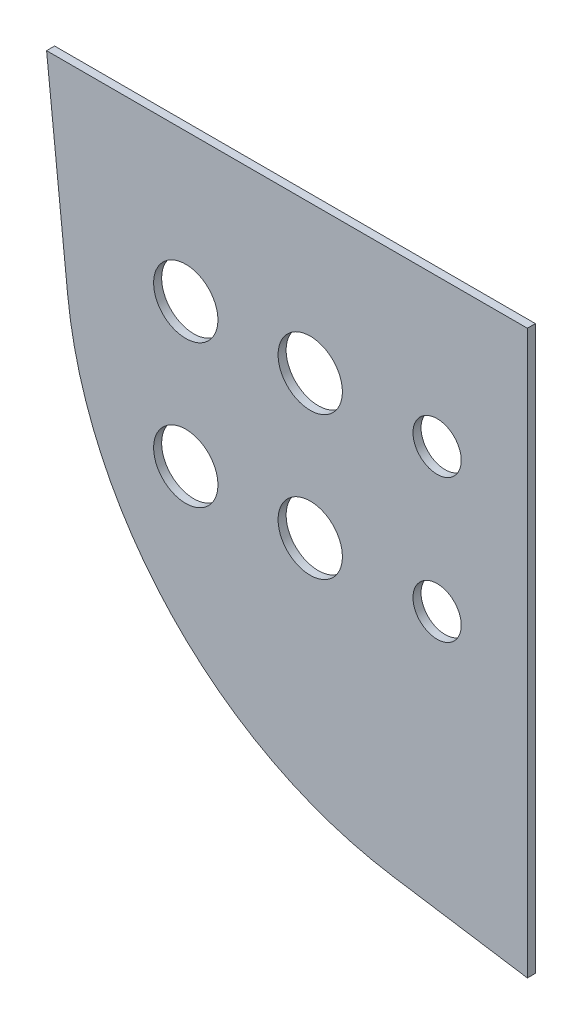
ISO-10303-21;
HEADER;
FILE_DESCRIPTION(('STEP AP214'),'2;1');
FILE_NAME('part.step','',(''),(''),'','','');
FILE_SCHEMA(('AUTOMOTIVE_DESIGN { 1 0 10303 214 1 1 1 1 }'));
ENDSEC;
DATA;
#1=APPLICATION_CONTEXT('core data for automotive mechanical design processes');
#2=APPLICATION_PROTOCOL_DEFINITION('international standard','automotive_design',2000,#1);
#3=PRODUCT_CONTEXT('',#1,'mechanical');
#4=PRODUCT('Part','Part','',(#3));
#5=PRODUCT_RELATED_PRODUCT_CATEGORY('part','',(#4));
#6=PRODUCT_DEFINITION_FORMATION('','',#4);
#7=PRODUCT_DEFINITION_CONTEXT('part definition',#1,'design');
#8=PRODUCT_DEFINITION('design','',#6,#7);
#9=PRODUCT_DEFINITION_SHAPE('','',#8);
#10=(LENGTH_UNIT() NAMED_UNIT(*) SI_UNIT(.MILLI.,.METRE.));
#11=(NAMED_UNIT(*) PLANE_ANGLE_UNIT() SI_UNIT($,.RADIAN.));
#12=(NAMED_UNIT(*) SI_UNIT($,.STERADIAN.) SOLID_ANGLE_UNIT());
#13=UNCERTAINTY_MEASURE_WITH_UNIT(LENGTH_MEASURE(1.E-05),#10,'distance_accuracy_value','');
#14=(GEOMETRIC_REPRESENTATION_CONTEXT(3) GLOBAL_UNCERTAINTY_ASSIGNED_CONTEXT((#13)) GLOBAL_UNIT_ASSIGNED_CONTEXT((#10,
#11,#12)) REPRESENTATION_CONTEXT('',''));
#15=CARTESIAN_POINT('',(0.,0.,0.));
#16=DIRECTION('',(0.,0.,1.));
#17=DIRECTION('',(1.,0.,0.));
#18=AXIS2_PLACEMENT_3D('',#15,#16,#17);
#19=CARTESIAN_POINT('',(-127.280074158773,-13.3703866150609,1.5875));
#20=DIRECTION('',(-0.994527813863511,-0.104472137203496,0.));
#21=DIRECTION('',(0.104472137203496,-0.994527813863511,0.));
#22=AXIS2_PLACEMENT_3D('',#19,#20,#21);
#23=PLANE('',#22);
#24=DIRECTION('',(-0.104472137203496,0.994527813863511,0.));
#25=VECTOR('',#24,1.);
#26=CARTESIAN_POINT('',(-127.280074158773,-13.3703866150609,0.));
#27=LINE('',#26,#25);
#28=CARTESIAN_POINT('',(-119.793452617314,-84.6396604535772,0.));
#29=VERTEX_POINT('',#28);
#30=CARTESIAN_POINT('',(-123.960996270356,-44.9665170740411,0.));
#31=VERTEX_POINT('',#30);
#32=EDGE_CURVE('E111',#29,#31,#27,.T.);
#33=ORIENTED_EDGE('',*,*,#32,.F.);
#34=DIRECTION('',(0.,0.,-1.));
#35=VECTOR('',#34,1.);
#36=CARTESIAN_POINT('',(-119.793452617314,-84.6396604535772,1.5875));
#37=LINE('',#36,#35);
#38=CARTESIAN_POINT('',(-119.793452617314,-84.6396604535772,1.5875));
#39=VERTEX_POINT('',#38);
#40=EDGE_CURVE('E11',#39,#29,#37,.T.);
#41=ORIENTED_EDGE('',*,*,#40,.F.);
#42=DIRECTION('',(-0.104472137203496,0.994527813863511,0.));
#43=VECTOR('',#42,1.);
#44=CARTESIAN_POINT('',(-127.280074158773,-13.3703866150609,1.5875));
#45=LINE('',#44,#43);
#46=CARTESIAN_POINT('',(-123.960996270356,-44.9665170740411,1.5875));
#47=VERTEX_POINT('',#46);
#48=EDGE_CURVE('E106',#39,#47,#45,.T.);
#49=ORIENTED_EDGE('',*,*,#48,.T.);
#50=DIRECTION('',(0.,0.,-1.));
#51=VECTOR('',#50,1.);
#52=CARTESIAN_POINT('',(-123.960996270356,-44.9665170740411,1.5875));
#53=LINE('',#52,#51);
#54=EDGE_CURVE('E52',#47,#31,#53,.T.);
#55=ORIENTED_EDGE('',*,*,#54,.T.);
#56=EDGE_LOOP('',(#33,#41,#49,#55));
#57=FACE_BOUND('',#56,.T.);
#58=ADVANCED_FACE('F36',(#57),#23,.T.);
#59=CARTESIAN_POINT('',(-44.0104332009142,-76.6788835986708,1.5875));
#60=DIRECTION('',(0.,0.,-1.));
#61=DIRECTION('',(-1.,0.,0.));
#62=AXIS2_PLACEMENT_3D('',#59,#60,#61);
#63=CYLINDRICAL_SURFACE('',#62,76.2);
#64=CARTESIAN_POINT('',(-44.0104332009142,-76.6788835986708,0.));
#65=DIRECTION('',(0.,0.,1.));
#66=DIRECTION('',(1.,0.,0.));
#67=AXIS2_PLACEMENT_3D('',#64,#65,#66);
#68=CIRCLE('',#67,76.2);
#69=CARTESIAN_POINT('',(-55.642806390686,-151.985775009576,0.));
#70=VERTEX_POINT('',#69);
#71=EDGE_CURVE('E113',#29,#70,#68,.T.);
#72=ORIENTED_EDGE('',*,*,#71,.T.);
#73=DIRECTION('',(0.,0.,-1.));
#74=VECTOR('',#73,1.);
#75=CARTESIAN_POINT('',(-55.642806390686,-151.985775009576,1.5875));
#76=LINE('',#75,#74);
#77=CARTESIAN_POINT('',(-55.642806390686,-151.985775009576,1.5875));
#78=VERTEX_POINT('',#77);
#79=EDGE_CURVE('E44',#78,#70,#76,.T.);
#80=ORIENTED_EDGE('',*,*,#79,.F.);
#81=CARTESIAN_POINT('',(-44.0104332009142,-76.6788835986708,1.5875));
#82=DIRECTION('',(0.,0.,1.));
#83=DIRECTION('',(1.,0.,0.));
#84=AXIS2_PLACEMENT_3D('',#81,#82,#83);
#85=CIRCLE('',#84,76.2);
#86=EDGE_CURVE('E103',#39,#78,#85,.T.);
#87=ORIENTED_EDGE('',*,*,#86,.F.);
#88=ORIENTED_EDGE('',*,*,#40,.T.);
#89=EDGE_LOOP('',(#72,#80,#87,#88));
#90=FACE_BOUND('',#89,.T.);
#91=ADVANCED_FACE('F126',(#90),#63,.T.);
#92=CARTESIAN_POINT('',(-24.2262659536632,-156.838570229883,1.5875));
#93=DIRECTION('',(-0.152655816138737,-0.988279414841276,0.));
#94=DIRECTION('',(0.988279414841277,-0.152655816138737,0.));
#95=AXIS2_PLACEMENT_3D('',#92,#93,#94);
#96=PLANE('',#95);
#97=DIRECTION('',(-0.988279414841277,0.152655816138737,0.));
#98=VECTOR('',#97,1.);
#99=CARTESIAN_POINT('',(-24.2262659536632,-156.838570229883,0.));
#100=LINE('',#99,#98);
#101=CARTESIAN_POINT('',(-29.0040645658582,-156.100561590283,0.));
#102=VERTEX_POINT('',#101);
#103=EDGE_CURVE('E91',#102,#70,#100,.T.);
#104=ORIENTED_EDGE('',*,*,#103,.F.);
#105=DIRECTION('',(0.,0.,-1.));
#106=VECTOR('',#105,1.);
#107=CARTESIAN_POINT('',(-29.0040645658582,-156.100561590283,1.5875));
#108=LINE('',#107,#106);
#109=CARTESIAN_POINT('',(-29.0040645658582,-156.100561590283,1.5875));
#110=VERTEX_POINT('',#109);
#111=EDGE_CURVE('E85',#110,#102,#108,.T.);
#112=ORIENTED_EDGE('',*,*,#111,.F.);
#113=DIRECTION('',(-0.988279414841277,0.152655816138737,0.));
#114=VECTOR('',#113,1.);
#115=CARTESIAN_POINT('',(-24.2262659536632,-156.838570229883,1.5875));
#116=LINE('',#115,#114);
#117=EDGE_CURVE('E89',#110,#78,#116,.T.);
#118=ORIENTED_EDGE('',*,*,#117,.T.);
#119=ORIENTED_EDGE('',*,*,#79,.T.);
#120=EDGE_LOOP('',(#104,#112,#118,#119));
#121=FACE_BOUND('',#120,.T.);
#122=ADVANCED_FACE('F87',(#121),#96,.T.);
#123=CARTESIAN_POINT('',(-29.0040645658582,0.,1.5875));
#124=DIRECTION('',(-1.,0.,0.));
#125=DIRECTION('',(0.,-1.,0.));
#126=AXIS2_PLACEMENT_3D('',#123,#124,#125);
#127=PLANE('',#126);
#128=DIRECTION('',(0.,1.,0.));
#129=VECTOR('',#128,1.);
#130=CARTESIAN_POINT('',(-29.0040645658582,0.,0.));
#131=LINE('',#130,#129);
#132=CARTESIAN_POINT('',(-29.0040645658582,-44.9665170740411,0.));
#133=VERTEX_POINT('',#132);
#134=EDGE_CURVE('E118',#102,#133,#131,.T.);
#135=ORIENTED_EDGE('',*,*,#134,.T.);
#136=DIRECTION('',(0.,0.,-1.));
#137=VECTOR('',#136,1.);
#138=CARTESIAN_POINT('',(-29.0040645658582,-44.9665170740411,1.5875));
#139=LINE('',#138,#137);
#140=CARTESIAN_POINT('',(-29.0040645658582,-44.9665170740411,1.5875));
#141=VERTEX_POINT('',#140);
#142=EDGE_CURVE('E69',#141,#133,#139,.T.);
#143=ORIENTED_EDGE('',*,*,#142,.F.);
#144=DIRECTION('',(0.,1.,0.));
#145=VECTOR('',#144,1.);
#146=CARTESIAN_POINT('',(-29.0040645658582,0.,1.5875));
#147=LINE('',#146,#145);
#148=EDGE_CURVE('E95',#110,#141,#147,.T.);
#149=ORIENTED_EDGE('',*,*,#148,.F.);
#150=ORIENTED_EDGE('',*,*,#111,.T.);
#151=EDGE_LOOP('',(#135,#143,#149,#150));
#152=FACE_BOUND('',#151,.T.);
#153=ADVANCED_FACE('F96',(#152),#127,.F.);
#154=CARTESIAN_POINT('',(0.,-44.9665170740411,1.5875));
#155=DIRECTION('',(0.,1.,0.));
#156=DIRECTION('',(0.,0.,1.));
#157=AXIS2_PLACEMENT_3D('',#154,#155,#156);
#158=PLANE('',#157);
#159=DIRECTION('',(1.,0.,0.));
#160=VECTOR('',#159,1.);
#161=CARTESIAN_POINT('',(0.,-44.9665170740411,0.));
#162=LINE('',#161,#160);
#163=EDGE_CURVE('E120',#31,#133,#162,.T.);
#164=ORIENTED_EDGE('',*,*,#163,.F.);
#165=ORIENTED_EDGE('',*,*,#54,.F.);
#166=DIRECTION('',(1.,0.,0.));
#167=VECTOR('',#166,1.);
#168=CARTESIAN_POINT('',(0.,-44.9665170740411,1.5875));
#169=LINE('',#168,#167);
#170=EDGE_CURVE('E99',#47,#141,#169,.T.);
#171=ORIENTED_EDGE('',*,*,#170,.T.);
#172=ORIENTED_EDGE('',*,*,#142,.T.);
#173=EDGE_LOOP('',(#164,#165,#171,#172));
#174=FACE_BOUND('',#173,.T.);
#175=ADVANCED_FACE('F129',(#174),#158,.T.);
#176=CARTESIAN_POINT('',(0.,0.,1.5875));
#177=DIRECTION('',(0.,0.,1.));
#178=DIRECTION('',(1.,0.,0.));
#179=AXIS2_PLACEMENT_3D('',#176,#177,#178);
#180=PLANE('',#179);
#181=CARTESIAN_POINT('',(-46.8315729706923,-74.1072066319575,1.5875));
#182=DIRECTION('',(0.,0.,-1.));
#183=DIRECTION('',(-1.,0.,0.));
#184=AXIS2_PLACEMENT_3D('',#181,#182,#183);
#185=CIRCLE('',#184,4.7625);
#186=CARTESIAN_POINT('',(-51.5940729706923,-74.1072066319575,1.5875));
#187=VERTEX_POINT('',#186);
#188=EDGE_CURVE('E235',#187,#187,#185,.T.);
#189=ORIENTED_EDGE('',*,*,#188,.T.);
#190=EDGE_LOOP('',(#189));
#191=FACE_BOUND('',#190,.T.);
#192=CARTESIAN_POINT('',(-96.475228053162,-102.315332665249,1.5875));
#193=DIRECTION('',(0.,0.,-1.));
#194=DIRECTION('',(-1.,0.,0.));
#195=AXIS2_PLACEMENT_3D('',#192,#193,#194);
#196=CIRCLE('',#195,6.34999999999999);
#197=CARTESIAN_POINT('',(-102.825228053162,-102.315332665249,1.5875));
#198=VERTEX_POINT('',#197);
#199=EDGE_CURVE('E261',#198,#198,#196,.T.);
#200=ORIENTED_EDGE('',*,*,#199,.T.);
#201=EDGE_LOOP('',(#200));
#202=FACE_BOUND('',#201,.T.);
#203=CARTESIAN_POINT('',(-71.8925163977779,-74.1072066319575,1.5875));
#204=DIRECTION('',(0.,0.,-1.));
#205=DIRECTION('',(-1.,0.,0.));
#206=AXIS2_PLACEMENT_3D('',#203,#204,#205);
#207=CIRCLE('',#206,6.34999999999999);
#208=CARTESIAN_POINT('',(-78.2425163977779,-74.1072066319575,1.5875));
#209=VERTEX_POINT('',#208);
#210=EDGE_CURVE('E255',#209,#209,#207,.T.);
#211=ORIENTED_EDGE('',*,*,#210,.T.);
#212=EDGE_LOOP('',(#211));
#213=FACE_BOUND('',#212,.T.);
#214=CARTESIAN_POINT('',(-96.475228053162,-74.1072066319575,1.5875));
#215=DIRECTION('',(0.,0.,-1.));
#216=DIRECTION('',(-1.,0.,0.));
#217=AXIS2_PLACEMENT_3D('',#214,#215,#216);
#218=CIRCLE('',#217,6.34999999999999);
#219=CARTESIAN_POINT('',(-102.825228053162,-74.1072066319575,1.5875));
#220=VERTEX_POINT('',#219);
#221=EDGE_CURVE('E248',#220,#220,#218,.T.);
#222=ORIENTED_EDGE('',*,*,#221,.T.);
#223=EDGE_LOOP('',(#222));
#224=FACE_BOUND('',#223,.T.);
#225=CARTESIAN_POINT('',(-46.8315729706923,-102.315332665249,1.5875));
#226=DIRECTION('',(0.,0.,-1.));
#227=DIRECTION('',(-1.,0.,0.));
#228=AXIS2_PLACEMENT_3D('',#225,#226,#227);
#229=CIRCLE('',#228,4.7625);
#230=CARTESIAN_POINT('',(-51.5940729706923,-102.315332665249,1.5875));
#231=VERTEX_POINT('',#230);
#232=EDGE_CURVE('E239',#231,#231,#229,.T.);
#233=ORIENTED_EDGE('',*,*,#232,.T.);
#234=EDGE_LOOP('',(#233));
#235=FACE_BOUND('',#234,.T.);
#236=CARTESIAN_POINT('',(-71.8925163977779,-102.315332665249,1.5875));
#237=DIRECTION('',(0.,0.,-1.));
#238=DIRECTION('',(-1.,0.,0.));
#239=AXIS2_PLACEMENT_3D('',#236,#237,#238);
#240=CIRCLE('',#239,6.34999999999999);
#241=CARTESIAN_POINT('',(-78.2425163977779,-102.315332665249,1.5875));
#242=VERTEX_POINT('',#241);
#243=EDGE_CURVE('E114',#242,#242,#240,.T.);
#244=ORIENTED_EDGE('',*,*,#243,.T.);
#245=EDGE_LOOP('',(#244));
#246=FACE_BOUND('',#245,.T.);
#247=ORIENTED_EDGE('',*,*,#48,.F.);
#248=ORIENTED_EDGE('',*,*,#86,.T.);
#249=ORIENTED_EDGE('',*,*,#117,.F.);
#250=ORIENTED_EDGE('',*,*,#148,.T.);
#251=ORIENTED_EDGE('',*,*,#170,.F.);
#252=EDGE_LOOP('',(#247,#248,#249,#250,#251));
#253=FACE_BOUND('',#252,.T.);
#254=ADVANCED_FACE('F102',(#191,#202,#213,#224,#235,#246,#253),#180,.T.);
#255=CARTESIAN_POINT('',(0.,0.,0.));
#256=DIRECTION('',(0.,0.,1.));
#257=DIRECTION('',(1.,0.,0.));
#258=AXIS2_PLACEMENT_3D('',#255,#256,#257);
#259=PLANE('',#258);
#260=CARTESIAN_POINT('',(-46.8315729706923,-74.1072066319575,0.));
#261=DIRECTION('',(0.,0.,-1.));
#262=DIRECTION('',(-1.,0.,0.));
#263=AXIS2_PLACEMENT_3D('',#260,#261,#262);
#264=CIRCLE('',#263,4.7625);
#265=CARTESIAN_POINT('',(-51.5940729706923,-74.1072066319575,0.));
#266=VERTEX_POINT('',#265);
#267=EDGE_CURVE('E238',#266,#266,#264,.T.);
#268=ORIENTED_EDGE('',*,*,#267,.F.);
#269=EDGE_LOOP('',(#268));
#270=FACE_BOUND('',#269,.T.);
#271=CARTESIAN_POINT('',(-96.475228053162,-102.315332665249,0.));
#272=DIRECTION('',(0.,0.,-1.));
#273=DIRECTION('',(-1.,0.,0.));
#274=AXIS2_PLACEMENT_3D('',#271,#272,#273);
#275=CIRCLE('',#274,6.34999999999999);
#276=CARTESIAN_POINT('',(-102.825228053162,-102.315332665249,0.));
#277=VERTEX_POINT('',#276);
#278=EDGE_CURVE('E241',#277,#277,#275,.T.);
#279=ORIENTED_EDGE('',*,*,#278,.F.);
#280=EDGE_LOOP('',(#279));
#281=FACE_BOUND('',#280,.T.);
#282=CARTESIAN_POINT('',(-71.8925163977779,-74.1072066319575,0.));
#283=DIRECTION('',(0.,0.,-1.));
#284=DIRECTION('',(-1.,0.,0.));
#285=AXIS2_PLACEMENT_3D('',#282,#283,#284);
#286=CIRCLE('',#285,6.34999999999999);
#287=CARTESIAN_POINT('',(-78.2425163977779,-74.1072066319575,0.));
#288=VERTEX_POINT('',#287);
#289=EDGE_CURVE('E258',#288,#288,#286,.T.);
#290=ORIENTED_EDGE('',*,*,#289,.F.);
#291=EDGE_LOOP('',(#290));
#292=FACE_BOUND('',#291,.T.);
#293=CARTESIAN_POINT('',(-96.475228053162,-74.1072066319575,0.));
#294=DIRECTION('',(0.,0.,-1.));
#295=DIRECTION('',(-1.,0.,0.));
#296=AXIS2_PLACEMENT_3D('',#293,#294,#295);
#297=CIRCLE('',#296,6.34999999999999);
#298=CARTESIAN_POINT('',(-102.825228053162,-74.1072066319575,0.));
#299=VERTEX_POINT('',#298);
#300=EDGE_CURVE('E252',#299,#299,#297,.T.);
#301=ORIENTED_EDGE('',*,*,#300,.F.);
#302=EDGE_LOOP('',(#301));
#303=FACE_BOUND('',#302,.T.);
#304=CARTESIAN_POINT('',(-46.8315729706923,-102.315332665249,0.));
#305=DIRECTION('',(0.,0.,-1.));
#306=DIRECTION('',(-1.,0.,0.));
#307=AXIS2_PLACEMENT_3D('',#304,#305,#306);
#308=CIRCLE('',#307,4.7625);
#309=CARTESIAN_POINT('',(-51.5940729706923,-102.315332665249,0.));
#310=VERTEX_POINT('',#309);
#311=EDGE_CURVE('E244',#310,#310,#308,.T.);
#312=ORIENTED_EDGE('',*,*,#311,.F.);
#313=EDGE_LOOP('',(#312));
#314=FACE_BOUND('',#313,.T.);
#315=CARTESIAN_POINT('',(-71.8925163977779,-102.315332665249,0.));
#316=DIRECTION('',(0.,0.,-1.));
#317=DIRECTION('',(-1.,0.,0.));
#318=AXIS2_PLACEMENT_3D('',#315,#316,#317);
#319=CIRCLE('',#318,6.34999999999999);
#320=CARTESIAN_POINT('',(-78.2425163977779,-102.315332665249,0.));
#321=VERTEX_POINT('',#320);
#322=EDGE_CURVE('E251',#321,#321,#319,.T.);
#323=ORIENTED_EDGE('',*,*,#322,.F.);
#324=EDGE_LOOP('',(#323));
#325=FACE_BOUND('',#324,.T.);
#326=ORIENTED_EDGE('',*,*,#32,.T.);
#327=ORIENTED_EDGE('',*,*,#163,.T.);
#328=ORIENTED_EDGE('',*,*,#134,.F.);
#329=ORIENTED_EDGE('',*,*,#103,.T.);
#330=ORIENTED_EDGE('',*,*,#71,.F.);
#331=EDGE_LOOP('',(#326,#327,#328,#329,#330));
#332=FACE_BOUND('',#331,.T.);
#333=ADVANCED_FACE('F128',(#270,#281,#292,#303,#314,#325,#332),#259,.F.);
#334=CARTESIAN_POINT('',(-71.8925163977779,-102.315332665249,1.5875));
#335=DIRECTION('',(0.,0.,-1.));
#336=DIRECTION('',(-1.,0.,0.));
#337=AXIS2_PLACEMENT_3D('',#334,#335,#336);
#338=CYLINDRICAL_SURFACE('',#337,6.34999999999999);
#339=ORIENTED_EDGE('',*,*,#243,.F.);
#340=EDGE_LOOP('',(#339));
#341=FACE_BOUND('',#340,.T.);
#342=ORIENTED_EDGE('',*,*,#322,.T.);
#343=EDGE_LOOP('',(#342));
#344=FACE_BOUND('',#343,.T.);
#345=ADVANCED_FACE('F170',(#341,#344),#338,.F.);
#346=CARTESIAN_POINT('',(-46.8315729706923,-102.315332665249,1.5875));
#347=DIRECTION('',(0.,0.,-1.));
#348=DIRECTION('',(-1.,0.,0.));
#349=AXIS2_PLACEMENT_3D('',#346,#347,#348);
#350=CYLINDRICAL_SURFACE('',#349,4.7625);
#351=ORIENTED_EDGE('',*,*,#232,.F.);
#352=EDGE_LOOP('',(#351));
#353=FACE_BOUND('',#352,.T.);
#354=ORIENTED_EDGE('',*,*,#311,.T.);
#355=EDGE_LOOP('',(#354));
#356=FACE_BOUND('',#355,.T.);
#357=ADVANCED_FACE('F178',(#353,#356),#350,.F.);
#358=CARTESIAN_POINT('',(-96.475228053162,-74.1072066319575,1.5875));
#359=DIRECTION('',(0.,0.,-1.));
#360=DIRECTION('',(-1.,0.,0.));
#361=AXIS2_PLACEMENT_3D('',#358,#359,#360);
#362=CYLINDRICAL_SURFACE('',#361,6.34999999999999);
#363=ORIENTED_EDGE('',*,*,#221,.F.);
#364=EDGE_LOOP('',(#363));
#365=FACE_BOUND('',#364,.T.);
#366=ORIENTED_EDGE('',*,*,#300,.T.);
#367=EDGE_LOOP('',(#366));
#368=FACE_BOUND('',#367,.T.);
#369=ADVANCED_FACE('F188',(#365,#368),#362,.F.);
#370=CARTESIAN_POINT('',(-71.8925163977779,-74.1072066319575,1.5875));
#371=DIRECTION('',(0.,0.,-1.));
#372=DIRECTION('',(-1.,0.,0.));
#373=AXIS2_PLACEMENT_3D('',#370,#371,#372);
#374=CYLINDRICAL_SURFACE('',#373,6.34999999999999);
#375=ORIENTED_EDGE('',*,*,#210,.F.);
#376=EDGE_LOOP('',(#375));
#377=FACE_BOUND('',#376,.T.);
#378=ORIENTED_EDGE('',*,*,#289,.T.);
#379=EDGE_LOOP('',(#378));
#380=FACE_BOUND('',#379,.T.);
#381=ADVANCED_FACE('F198',(#377,#380),#374,.F.);
#382=CARTESIAN_POINT('',(-96.475228053162,-102.315332665249,1.5875));
#383=DIRECTION('',(0.,0.,-1.));
#384=DIRECTION('',(-1.,0.,0.));
#385=AXIS2_PLACEMENT_3D('',#382,#383,#384);
#386=CYLINDRICAL_SURFACE('',#385,6.34999999999999);
#387=ORIENTED_EDGE('',*,*,#199,.F.);
#388=EDGE_LOOP('',(#387));
#389=FACE_BOUND('',#388,.T.);
#390=ORIENTED_EDGE('',*,*,#278,.T.);
#391=EDGE_LOOP('',(#390));
#392=FACE_BOUND('',#391,.T.);
#393=ADVANCED_FACE('F208',(#389,#392),#386,.F.);
#394=CARTESIAN_POINT('',(-46.8315729706923,-74.1072066319575,1.5875));
#395=DIRECTION('',(0.,0.,-1.));
#396=DIRECTION('',(-1.,0.,0.));
#397=AXIS2_PLACEMENT_3D('',#394,#395,#396);
#398=CYLINDRICAL_SURFACE('',#397,4.7625);
#399=ORIENTED_EDGE('',*,*,#188,.F.);
#400=EDGE_LOOP('',(#399));
#401=FACE_BOUND('',#400,.T.);
#402=ORIENTED_EDGE('',*,*,#267,.T.);
#403=EDGE_LOOP('',(#402));
#404=FACE_BOUND('',#403,.T.);
#405=ADVANCED_FACE('F218',(#401,#404),#398,.F.);
#406=CLOSED_SHELL('',(#58,#91,#122,#153,#175,#254,#333,#345,#357,#369,#381,#393,#405));
#407=MANIFOLD_SOLID_BREP('B2',#406);
#408=ADVANCED_BREP_SHAPE_REPRESENTATION('',(#18,#407),#14);
#409=SHAPE_DEFINITION_REPRESENTATION(#9,#408);
ENDSEC;
END-ISO-10303-21;
